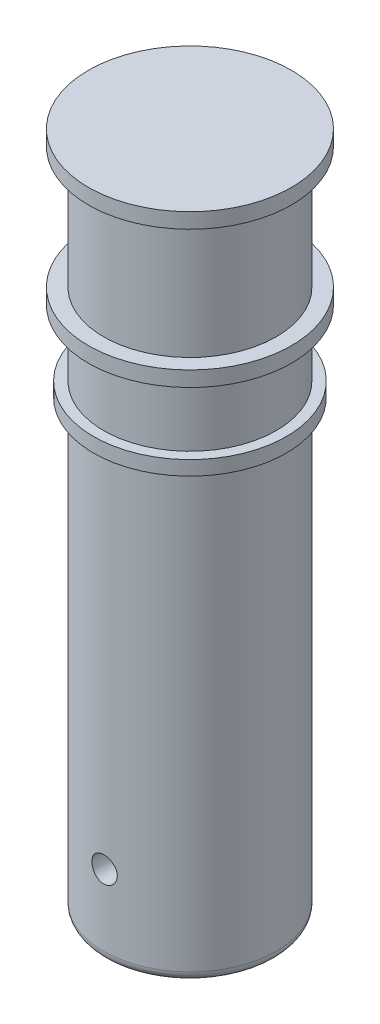
ISO-10303-21;
HEADER;
FILE_DESCRIPTION(('STEP AP214'),'2;1');
FILE_NAME('part.step','',(''),(''),'','','');
FILE_SCHEMA(('AUTOMOTIVE_DESIGN { 1 0 10303 214 1 1 1 1 }'));
ENDSEC;
DATA;
#1=APPLICATION_CONTEXT('core data for automotive mechanical design processes');
#2=APPLICATION_PROTOCOL_DEFINITION('international standard','automotive_design',2000,#1);
#3=PRODUCT_CONTEXT('',#1,'mechanical');
#4=PRODUCT('Part','Part','',(#3));
#5=PRODUCT_RELATED_PRODUCT_CATEGORY('part','',(#4));
#6=PRODUCT_DEFINITION_FORMATION('','',#4);
#7=PRODUCT_DEFINITION_CONTEXT('part definition',#1,'design');
#8=PRODUCT_DEFINITION('design','',#6,#7);
#9=PRODUCT_DEFINITION_SHAPE('','',#8);
#10=(LENGTH_UNIT() NAMED_UNIT(*) SI_UNIT(.MILLI.,.METRE.));
#11=(NAMED_UNIT(*) PLANE_ANGLE_UNIT() SI_UNIT($,.RADIAN.));
#12=(NAMED_UNIT(*) SI_UNIT($,.STERADIAN.) SOLID_ANGLE_UNIT());
#13=UNCERTAINTY_MEASURE_WITH_UNIT(LENGTH_MEASURE(1.E-05),#10,'distance_accuracy_value','');
#14=(GEOMETRIC_REPRESENTATION_CONTEXT(3) GLOBAL_UNCERTAINTY_ASSIGNED_CONTEXT((#13)) GLOBAL_UNIT_ASSIGNED_CONTEXT((#10,
#11,#12)) REPRESENTATION_CONTEXT('',''));
#15=CARTESIAN_POINT('',(0.,0.,0.));
#16=DIRECTION('',(0.,0.,1.));
#17=DIRECTION('',(1.,0.,0.));
#18=AXIS2_PLACEMENT_3D('',#15,#16,#17);
#19=CARTESIAN_POINT('',(0.,-37.915,0.));
#20=DIRECTION('',(0.,-1.,0.));
#21=DIRECTION('',(1.,0.,0.));
#22=AXIS2_PLACEMENT_3D('',#19,#20,#21);
#23=PLANE('',#22);
#24=CARTESIAN_POINT('',(0.,-37.915,0.));
#25=DIRECTION('',(0.,1.,0.));
#26=DIRECTION('',(-1.,0.,0.));
#27=AXIS2_PLACEMENT_3D('',#24,#25,#26);
#28=CIRCLE('',#27,4.);
#29=CARTESIAN_POINT('',(-4.,-37.915,0.));
#30=VERTEX_POINT('',#29);
#31=EDGE_CURVE('E57',#30,#30,#28,.T.);
#32=ORIENTED_EDGE('',*,*,#31,.F.);
#33=EDGE_LOOP('',(#32));
#34=FACE_BOUND('',#33,.T.);
#35=ADVANCED_FACE('F37',(#34),#23,.T.);
#36=CARTESIAN_POINT('',(0.,15.,0.));
#37=DIRECTION('',(0.,1.,0.));
#38=DIRECTION('',(-1.,0.,0.));
#39=AXIS2_PLACEMENT_3D('',#36,#37,#38);
#40=CYLINDRICAL_SURFACE('',#39,4.);
#41=CARTESIAN_POINT('',(-1.25,-43.915,3.79967103839267));
#42=CARTESIAN_POINT('',(-1.24999953780047,-43.8466529638907,3.79967145961936));
#43=CARTESIAN_POINT('',(-1.24437538791494,-43.7783012312968,3.80153531505043));
#44=CARTESIAN_POINT('',(-1.22209175401327,-43.6436058391222,3.80875638998877));
#45=CARTESIAN_POINT('',(-1.20542928782515,-43.5772627272678,3.81411455353136));
#46=CARTESIAN_POINT('',(-1.16169788223559,-43.448555098068,3.8276593883596));
#47=CARTESIAN_POINT('',(-1.13464735736677,-43.3861837668943,3.83584105194317));
#48=CARTESIAN_POINT('',(-1.07096914173157,-43.266847304136,3.85410406218688));
#49=CARTESIAN_POINT('',(-1.03433975905632,-43.2098831300399,3.8641857443584));
#50=CARTESIAN_POINT('',(-0.951196070622293,-43.1010211325065,3.8855012766862));
#51=CARTESIAN_POINT('',(-0.904409399720399,-43.049336390564,3.8967612338478));
#52=CARTESIAN_POINT('',(-0.802862046455494,-42.9544039867908,3.91894245860335));
#53=CARTESIAN_POINT('',(-0.748100252518563,-42.9111575030552,3.92986367872627));
#54=CARTESIAN_POINT('',(-0.630625912493361,-42.8333889369888,3.95043553390078));
#55=CARTESIAN_POINT('',(-0.567761556520095,-42.7990862961685,3.9600518456278));
#56=CARTESIAN_POINT('',(-0.436804232853406,-42.7416239501445,3.97662551833019));
#57=CARTESIAN_POINT('',(-0.368712498487055,-42.7184616258504,3.98358350419919));
#58=CARTESIAN_POINT('',(-0.231464356966101,-42.6846488719029,3.99387175820862));
#59=CARTESIAN_POINT('',(-0.162405715468218,-42.6736342502122,3.99730738984143));
#60=CARTESIAN_POINT('',(-0.0233408139845233,-42.6632756535625,4.00053595876015));
#61=CARTESIAN_POINT('',(0.0466652269730806,-42.6639290256412,4.00032972410065));
#62=CARTESIAN_POINT('',(0.183074480354733,-42.6766482915859,3.99637116132537));
#63=CARTESIAN_POINT('',(0.249518634314043,-42.688319383513,3.99274150972157));
#64=CARTESIAN_POINT('',(0.379453063347769,-42.722094990043,3.98249482560855));
#65=CARTESIAN_POINT('',(0.442943145481195,-42.7442001850866,3.97587759827134));
#66=CARTESIAN_POINT('',(0.56607810315478,-42.7984701890749,3.96023459729533));
#67=CARTESIAN_POINT('',(0.62566640562283,-42.830754808563,3.95118033616957));
#68=CARTESIAN_POINT('',(0.738702511152028,-42.9043710997046,3.93161722953562));
#69=CARTESIAN_POINT('',(0.792148756208837,-42.9457050591378,3.92110801644584));
#70=CARTESIAN_POINT('',(0.89373769845388,-43.0382736348013,3.89923670734647));
#71=CARTESIAN_POINT('',(0.941566549094178,-43.0898490688412,3.88785731989084));
#72=CARTESIAN_POINT('',(1.02798974259538,-43.2003951018245,3.86590615440413));
#73=CARTESIAN_POINT('',(1.06658299775341,-43.259366570575,3.85533447159847));
#74=CARTESIAN_POINT('',(1.13380465019765,-43.3839174688598,3.83610846648974));
#75=CARTESIAN_POINT('',(1.16231680702682,-43.4495634090424,3.82747690354324));
#76=CARTESIAN_POINT('',(1.20778345948513,-43.5850594918954,3.81337545338913));
#77=CARTESIAN_POINT('',(1.22474210765793,-43.6549081142105,3.80790443033294));
#78=CARTESIAN_POINT('',(1.24601485185708,-43.7938199525658,3.80099563391872));
#79=CARTESIAN_POINT('',(1.25080954353711,-43.8628019962321,3.79940466389696));
#80=CARTESIAN_POINT('',(1.24896744498307,-44.0005897414982,3.80001077463985));
#81=CARTESIAN_POINT('',(1.24233242111456,-44.0693954687005,3.8022072700839));
#82=CARTESIAN_POINT('',(1.21824873513143,-44.2028082966516,3.80998957482874));
#83=CARTESIAN_POINT('',(1.20111831160538,-44.267479274074,3.81547554101732));
#84=CARTESIAN_POINT('',(1.15690373661027,-44.393021791996,3.82911287331661));
#85=CARTESIAN_POINT('',(1.12981796171155,-44.4538927109212,3.83726467412388));
#86=CARTESIAN_POINT('',(1.06557510655875,-44.5720391097718,3.85560539653156));
#87=CARTESIAN_POINT('',(1.02815147488557,-44.6291614155928,3.86584603489733));
#88=CARTESIAN_POINT('',(0.94460640867981,-44.7364903463619,3.88710348972829));
#89=CARTESIAN_POINT('',(0.898482714690782,-44.7866951689253,3.89812050735703));
#90=CARTESIAN_POINT('',(0.796572947753604,-44.8809103659128,3.92024187562679));
#91=CARTESIAN_POINT('',(0.740465649788521,-44.9245777861399,3.9313309228568));
#92=CARTESIAN_POINT('',(0.621451545651399,-45.0018910433213,3.95189059843678));
#93=CARTESIAN_POINT('',(0.558545051108625,-45.035537339311,3.96136130090946));
#94=CARTESIAN_POINT('',(0.428105523331832,-45.0915305624717,3.97756311928512));
#95=CARTESIAN_POINT('',(0.360610184283756,-45.1139592878437,3.984313995612));
#96=CARTESIAN_POINT('',(0.222557254056389,-45.1470725385897,3.99440242648576));
#97=CARTESIAN_POINT('',(0.152000628340356,-45.1577607390835,3.99774104914277));
#98=CARTESIAN_POINT('',(0.0129849366488987,-45.1667910017496,4.00055803404462));
#99=CARTESIAN_POINT('',(-0.0554391919465219,-45.1656284501708,4.0001912940739));
#100=CARTESIAN_POINT('',(-0.191073221923247,-45.1521881889513,3.99600978081049));
#101=CARTESIAN_POINT('',(-0.258283202179567,-45.1399112040081,3.99219523232619));
#102=CARTESIAN_POINT('',(-0.388755118480791,-45.1049059907777,3.98159570844796));
#103=CARTESIAN_POINT('',(-0.452055918449482,-45.0823103921546,3.97484847960205));
#104=CARTESIAN_POINT('',(-0.573998425500092,-45.0274291727915,3.9590794558795));
#105=CARTESIAN_POINT('',(-0.632639331274482,-44.9951418900266,3.95005727091358));
#106=CARTESIAN_POINT('',(-0.745761694969687,-44.9205272416556,3.93029896883376));
#107=CARTESIAN_POINT('',(-0.80003460705311,-44.877896477536,3.91951509750962));
#108=CARTESIAN_POINT('',(-0.900820791399316,-44.7843401105565,3.89758736547061));
#109=CARTESIAN_POINT('',(-0.947331733504156,-44.7334120258606,3.88644339784826));
#110=CARTESIAN_POINT('',(-1.03282865911252,-44.6226842801589,3.86461892577438));
#111=CARTESIAN_POINT('',(-1.07151427994711,-44.5626465968834,3.85396600863456));
#112=CARTESIAN_POINT('',(-1.13820470748521,-44.4366018797309,3.83480125279531));
#113=CARTESIAN_POINT('',(-1.16621383403546,-44.3705972735497,3.82628854861386));
#114=CARTESIAN_POINT('',(-1.20871180435792,-44.2402773826853,3.81306560440327));
#115=CARTESIAN_POINT('',(-1.22414939837873,-44.1762974525484,3.80809315043749));
#116=CARTESIAN_POINT('',(-1.244792458161,-44.0465461679035,3.80139606482398));
#117=CARTESIAN_POINT('',(-1.25000044480778,-43.9807752587985,3.79967063301598));
#118=CARTESIAN_POINT('',(-1.25,-43.915,3.79967103839267));
#119=B_SPLINE_CURVE_WITH_KNOTS('',3,(#41,#42,#43,#44,#45,#46,#47,#48,#49,#50,#51,#52,#53,#54,
#55,#56,#57,#58,#59,#60,#61,#62,#63,#64,#65,#66,#67,#68,#69,#70,#71,#72,#73,#74,#75,#76,#77,#78,
#79,#80,#81,#82,#83,#84,#85,#86,#87,#88,#89,#90,#91,#92,#93,#94,#95,#96,#97,#98,#99,#100,#101,
#102,#103,#104,#105,#106,#107,#108,#109,#110,#111,#112,#113,#114,#115,#116,#117,#118),
.UNSPECIFIED.,.T.,.F.,(4,2,2,2,2,2,2,2,2,2,2,2,2,2,2,2,2,2,2,2,2,2,2,2,2,2,2,2,2,2,2,2,2,2,2,2,
2,2,4),(0.,0.204798137548501,0.409651627059736,0.614143644118579,0.818671804924945,
1.02957080550838,1.24049922941123,1.45619821963733,1.67184647417921,1.88083722835533,
2.08978046471774,2.2915098296975,2.49325235190093,2.69746404608409,2.90172742713187,
3.11450338937334,3.32730439853776,3.54248470934454,3.75758763952753,3.96404933287934,
4.17047912219088,4.37093972044362,4.5714330225321,4.7776761330961,4.9839728801188,
5.1988193781151,5.41365603317086,5.62690239290998,5.84008198140585,6.04438802439524,
6.24868074692306,6.45041846514759,6.65219079911652,6.86080693105214,7.06948557772189,
7.28507795501704,7.50058300803822,7.69772354371385,7.89481549188778),.UNSPECIFIED.);
#120=CARTESIAN_POINT('',(-1.25,-43.915,3.79967103839267));
#121=VERTEX_POINT('',#120);
#122=EDGE_CURVE('E93',#121,#121,#119,.T.);
#123=ORIENTED_EDGE('',*,*,#122,.F.);
#124=EDGE_LOOP('',(#123));
#125=FACE_BOUND('',#124,.T.);
#126=CARTESIAN_POINT('',(0.,-50.915,0.));
#127=DIRECTION('',(0.,-1.,0.));
#128=DIRECTION('',(1.,0.,0.));
#129=AXIS2_PLACEMENT_3D('',#126,#127,#128);
#130=CIRCLE('',#129,4.);
#131=CARTESIAN_POINT('',(4.00000000000001,-50.915,0.));
#132=VERTEX_POINT('',#131);
#133=EDGE_CURVE('E10',#132,#132,#130,.T.);
#134=ORIENTED_EDGE('',*,*,#133,.T.);
#135=EDGE_LOOP('',(#134));
#136=FACE_BOUND('',#135,.T.);
#137=ORIENTED_EDGE('',*,*,#31,.T.);
#138=EDGE_LOOP('',(#137));
#139=FACE_BOUND('',#138,.T.);
#140=ADVANCED_FACE('F106',(#125,#136,#139),#40,.F.);
#141=CARTESIAN_POINT('',(-4.,-51.915,0.));
#142=DIRECTION('',(0.,-1.,0.));
#143=DIRECTION('',(1.,0.,0.));
#144=AXIS2_PLACEMENT_3D('',#141,#142,#143);
#145=PLANE('',#144);
#146=CARTESIAN_POINT('',(0.,-51.915,0.));
#147=DIRECTION('',(0.,-1.,0.));
#148=DIRECTION('',(1.,0.,0.));
#149=AXIS2_PLACEMENT_3D('',#146,#147,#148);
#150=CIRCLE('',#149,7.5);
#151=CARTESIAN_POINT('',(7.5,-51.915,0.));
#152=VERTEX_POINT('',#151);
#153=EDGE_CURVE('E44',#152,#152,#150,.T.);
#154=ORIENTED_EDGE('',*,*,#153,.T.);
#155=EDGE_LOOP('',(#154));
#156=FACE_BOUND('',#155,.T.);
#157=CARTESIAN_POINT('',(0.,-51.915,0.));
#158=DIRECTION('',(0.,-1.,0.));
#159=DIRECTION('',(1.,0.,0.));
#160=AXIS2_PLACEMENT_3D('',#157,#158,#159);
#161=CIRCLE('',#160,5.);
#162=CARTESIAN_POINT('',(5.00000000000001,-51.915,0.));
#163=VERTEX_POINT('',#162);
#164=EDGE_CURVE('E48',#163,#163,#161,.F.);
#165=ORIENTED_EDGE('',*,*,#164,.T.);
#166=EDGE_LOOP('',(#165));
#167=FACE_BOUND('',#166,.T.);
#168=ADVANCED_FACE('F164',(#156,#167),#145,.T.);
#169=CARTESIAN_POINT('',(0.,15.,0.));
#170=DIRECTION('',(0.,1.,0.));
#171=DIRECTION('',(-1.,0.,0.));
#172=AXIS2_PLACEMENT_3D('',#169,#170,#171);
#173=CYLINDRICAL_SURFACE('',#172,8.49999999999999);
#174=CARTESIAN_POINT('',(-1.25,-43.915,8.40758586040011));
#175=CARTESIAN_POINT('',(-1.24999710510227,-43.9848045307349,8.40758700940734));
#176=CARTESIAN_POINT('',(-1.24413302561147,-44.0546499774146,8.408464600162));
#177=CARTESIAN_POINT('',(-1.22083722377046,-44.1923892099967,8.41187789658697));
#178=CARTESIAN_POINT('',(-1.20339411636137,-44.2602810063584,8.41441523416455));
#179=CARTESIAN_POINT('',(-1.15747242113108,-44.3920991959618,8.42085456460099));
#180=CARTESIAN_POINT('',(-1.12900217790827,-44.4560285453842,8.42475552534398));
#181=CARTESIAN_POINT('',(-1.06185381528303,-44.5781932019976,8.43348133440081));
#182=CARTESIAN_POINT('',(-1.02317714404783,-44.6364293153837,8.43830605161827));
#183=CARTESIAN_POINT('',(-0.936395680627589,-44.7460121715149,8.44837729235549));
#184=CARTESIAN_POINT('',(-0.888227811627049,-44.797308722437,8.45362649120866));
#185=CARTESIAN_POINT('',(-0.783967427241611,-44.8911215515143,8.46393134335555));
#186=CARTESIAN_POINT('',(-0.727874481842023,-44.9336373529176,8.46898698612797));
#187=CARTESIAN_POINT('',(-0.609035362725142,-45.008866414533,8.4783630159218));
#188=CARTESIAN_POINT('',(-0.546259688480517,-45.0415335461939,8.48267990326487));
#189=CARTESIAN_POINT('',(-0.416038601354244,-45.0958420195621,8.49006242091287));
#190=CARTESIAN_POINT('',(-0.348593426034829,-45.1174839217137,8.49312811481799));
#191=CARTESIAN_POINT('',(-0.211464398495231,-45.1489757010046,8.49764395451441));
#192=CARTESIAN_POINT('',(-0.141800218809728,-45.1589095651021,8.49910560156349));
#193=CARTESIAN_POINT('',(-0.00177945680603085,-45.1669640047736,8.50028806047439));
#194=CARTESIAN_POINT('',(0.0685770882440742,-45.1650852127547,8.50000896552926));
#195=CARTESIAN_POINT('',(0.20741260926797,-45.1496340815761,8.49775059098031));
#196=CARTESIAN_POINT('',(0.275901884682537,-45.1361520951745,8.49578444857936));
#197=CARTESIAN_POINT('',(0.409635277137452,-45.0980190301375,8.49038753926088));
#198=CARTESIAN_POINT('',(0.474879313262815,-45.073367673166,8.48695673584473));
#199=CARTESIAN_POINT('',(0.600544454522743,-45.0135026788097,8.47899339387314));
#200=CARTESIAN_POINT('',(0.66094711365584,-44.9782508702462,8.47445688515938));
#201=CARTESIAN_POINT('',(0.775013746624383,-44.8982134973463,8.46478797434031));
#202=CARTESIAN_POINT('',(0.828677293524276,-44.8534273294741,8.45965553452124));
#203=CARTESIAN_POINT('',(0.928274771197664,-44.7550888692555,8.44931012765942));
#204=CARTESIAN_POINT('',(0.97413083344061,-44.7014577081385,8.44409685803329));
#205=CARTESIAN_POINT('',(1.05620396332034,-44.5872199852064,8.43422475926411));
#206=CARTESIAN_POINT('',(1.09242097588368,-44.5266133835396,8.429565933289));
#207=CARTESIAN_POINT('',(1.15419768439827,-44.4000655107819,8.42133032189469));
#208=CARTESIAN_POINT('',(1.17974960098851,-44.3341203873689,8.41775432683684));
#209=CARTESIAN_POINT('',(1.21939363445995,-44.1988104313511,8.41210341899183));
#210=CARTESIAN_POINT('',(1.23348652609985,-44.1294458302779,8.41002840472255));
#211=CARTESIAN_POINT('',(1.24970613657199,-43.989958088404,8.40763356673708));
#212=CARTESIAN_POINT('',(1.25194313773078,-43.9198480391685,8.40729756756401));
#213=CARTESIAN_POINT('',(1.2446798881272,-43.7802540518017,8.40837587949711));
#214=CARTESIAN_POINT('',(1.23517998693919,-43.7107700950848,8.40979013847321));
#215=CARTESIAN_POINT('',(1.20480604960235,-43.5747409257275,8.41419476930312));
#216=CARTESIAN_POINT('',(1.18398676081403,-43.5081832213757,8.41717755257087));
#217=CARTESIAN_POINT('',(1.13162190536935,-43.3795023379237,8.42437690391731));
#218=CARTESIAN_POINT('',(1.10007582796816,-43.3173793701493,8.42859353074283));
#219=CARTESIAN_POINT('',(1.02688712390612,-43.198836456236,8.43782365247836));
#220=CARTESIAN_POINT('',(0.985172989894867,-43.1424610987135,8.44284270041291));
#221=CARTESIAN_POINT('',(0.892931901207418,-43.0374716244546,8.45309533274159));
#222=CARTESIAN_POINT('',(0.842404468153765,-42.9888579292883,8.45832892876938));
#223=CARTESIAN_POINT('',(0.733485882129778,-42.9003767814535,8.46847140977382));
#224=CARTESIAN_POINT('',(0.675035107129501,-42.860582337148,8.47337736523611));
#225=CARTESIAN_POINT('',(0.552214316327245,-42.7913775225772,8.48226649910813));
#226=CARTESIAN_POINT('',(0.487844457355889,-42.7619668772851,8.48624970195704));
#227=CARTESIAN_POINT('',(0.355242512242695,-42.7144816728052,8.4928316761749));
#228=CARTESIAN_POINT('',(0.287025077389444,-42.6963669085891,8.49543535260939));
#229=CARTESIAN_POINT('',(0.148475541166711,-42.671857469766,8.49898547341227));
#230=CARTESIAN_POINT('',(0.0781435740928537,-42.6654620524455,8.49993202280092));
#231=CARTESIAN_POINT('',(-0.0619298668379428,-42.6645904384732,8.50006025774637));
#232=CARTESIAN_POINT('',(-0.131670655626724,-42.6700024258134,8.49925849979376));
#233=CARTESIAN_POINT('',(-0.269239179820509,-42.6923526840448,8.49601352815675));
#234=CARTESIAN_POINT('',(-0.337066920661137,-42.7092909221824,8.49357031913676));
#235=CARTESIAN_POINT('',(-0.468855272056405,-42.7541737577989,8.48731568295444));
#236=CARTESIAN_POINT('',(-0.532818464760778,-42.7821109102611,8.48350518144819));
#237=CARTESIAN_POINT('',(-0.655166929115879,-42.8481866771456,8.47493492093455));
#238=CARTESIAN_POINT('',(-0.713552033805032,-42.8863255967943,8.4701751335266));
#239=CARTESIAN_POINT('',(-0.823654696466402,-42.972127837482,8.46018209258476));
#240=CARTESIAN_POINT('',(-0.875307495715045,-43.0198738136239,8.45494496231288));
#241=CARTESIAN_POINT('',(-0.969908817337546,-43.123361010639,8.44461647463574));
#242=CARTESIAN_POINT('',(-1.01285529235082,-43.1791041068472,8.43952515175939));
#243=CARTESIAN_POINT('',(-1.08903160606816,-43.2973554895497,8.43003535108945));
#244=CARTESIAN_POINT('',(-1.12220785319988,-43.3598986035356,8.4256407535303));
#245=CARTESIAN_POINT('',(-1.17753570240274,-43.4897037247094,8.41808744433527));
#246=CARTESIAN_POINT('',(-1.19969881567852,-43.5569607205443,8.41492744301018));
#247=CARTESIAN_POINT('',(-1.22730605825343,-43.6729382510754,8.41093594969734));
#248=CARTESIAN_POINT('',(-1.23580336635801,-43.7209403764295,8.40968627498973));
#249=CARTESIAN_POINT('',(-1.24715131261068,-43.8176217018972,8.40801083456298));
#250=CARTESIAN_POINT('',(-1.25000201962438,-43.8663008937459,8.40758505879563));
#251=CARTESIAN_POINT('',(-1.25,-43.915,8.40758586040011));
#252=B_SPLINE_CURVE_WITH_KNOTS('',3,(#174,#175,#176,#177,#178,#179,#180,#181,#182,#183,#184,
#185,#186,#187,#188,#189,#190,#191,#192,#193,#194,#195,#196,#197,#198,#199,#200,#201,#202,#203,
#204,#205,#206,#207,#208,#209,#210,#211,#212,#213,#214,#215,#216,#217,#218,#219,#220,#221,#222,
#223,#224,#225,#226,#227,#228,#229,#230,#231,#232,#233,#234,#235,#236,#237,#238,#239,#240,#241,
#242,#243,#244,#245,#246,#247,#248,#249,#250,#251),.UNSPECIFIED.,.T.,.F.,(4,2,2,2,2,2,2,2,2,2,2,
2,2,2,2,2,2,2,2,2,2,2,2,2,2,2,2,2,2,2,2,2,2,2,2,2,2,2,4),(0.,0.209235604041352,
0.418677243956451,0.627960701137757,0.837214479508831,1.0479089137279,1.25861478462188,
1.47029273888423,1.68195993187107,1.8920993174321,2.10222745298405,2.3107339980099,
2.51924573921819,2.72851748935693,2.9378024905773,3.14906598586865,3.36033068820406,
3.57174922359478,3.78315346353081,3.99258774581621,4.20201579041742,4.41043981091345,
4.61887375669134,4.82881810275995,5.03877384795542,5.25040763301589,5.46203581229343,
5.67290638591942,5.88376359516139,6.09263266274005,6.30150113679018,6.51022847299387,
6.71896205480251,6.92957482323234,7.14023706160588,7.35203417379323,7.56360944219752,
7.70958436789297,7.85555751327589),.UNSPECIFIED.);
#253=CARTESIAN_POINT('',(-1.25,-43.915,8.40758586040011));
#254=VERTEX_POINT('',#253);
#255=EDGE_CURVE('E101',#254,#254,#252,.T.);
#256=ORIENTED_EDGE('',*,*,#255,.F.);
#257=EDGE_LOOP('',(#256));
#258=FACE_BOUND('',#257,.T.);
#259=CARTESIAN_POINT('',(0.,-50.915,0.));
#260=DIRECTION('',(0.,-1.,0.));
#261=DIRECTION('',(1.,0.,0.));
#262=AXIS2_PLACEMENT_3D('',#259,#260,#261);
#263=CIRCLE('',#262,8.49999999999999);
#264=CARTESIAN_POINT('',(8.5,-50.915,0.));
#265=VERTEX_POINT('',#264);
#266=EDGE_CURVE('E52',#265,#265,#263,.F.);
#267=ORIENTED_EDGE('',*,*,#266,.T.);
#268=EDGE_LOOP('',(#267));
#269=FACE_BOUND('',#268,.T.);
#270=CARTESIAN_POINT('',(0.,-7.91500000000001,0.));
#271=DIRECTION('',(0.,1.,0.));
#272=DIRECTION('',(-1.,0.,0.));
#273=AXIS2_PLACEMENT_3D('',#270,#271,#272);
#274=CIRCLE('',#273,8.49999999999999);
#275=CARTESIAN_POINT('',(-8.49999999999999,-7.91500000000001,0.));
#276=VERTEX_POINT('',#275);
#277=EDGE_CURVE('E60',#276,#276,#274,.T.);
#278=ORIENTED_EDGE('',*,*,#277,.F.);
#279=EDGE_LOOP('',(#278));
#280=FACE_BOUND('',#279,.T.);
#281=ADVANCED_FACE('F161',(#258,#269,#280),#173,.T.);
#282=CARTESIAN_POINT('',(-8.49999999999999,-7.91500000000001,0.));
#283=DIRECTION('',(0.,-1.,0.));
#284=DIRECTION('',(1.,0.,0.));
#285=AXIS2_PLACEMENT_3D('',#282,#283,#284);
#286=PLANE('',#285);
#287=ORIENTED_EDGE('',*,*,#277,.T.);
#288=EDGE_LOOP('',(#287));
#289=FACE_BOUND('',#288,.T.);
#290=CARTESIAN_POINT('',(0.,-7.91500000000001,0.));
#291=DIRECTION('',(0.,1.,0.));
#292=DIRECTION('',(-1.,0.,0.));
#293=AXIS2_PLACEMENT_3D('',#290,#291,#292);
#294=CIRCLE('',#293,9.49999999999999);
#295=CARTESIAN_POINT('',(-9.49999999999999,-7.91500000000001,0.));
#296=VERTEX_POINT('',#295);
#297=EDGE_CURVE('E63',#296,#296,#294,.T.);
#298=ORIENTED_EDGE('',*,*,#297,.F.);
#299=EDGE_LOOP('',(#298));
#300=FACE_BOUND('',#299,.T.);
#301=ADVANCED_FACE('F157',(#289,#300),#286,.T.);
#302=CARTESIAN_POINT('',(0.,15.,0.));
#303=DIRECTION('',(0.,1.,0.));
#304=DIRECTION('',(-1.,0.,0.));
#305=AXIS2_PLACEMENT_3D('',#302,#303,#304);
#306=CYLINDRICAL_SURFACE('',#305,9.49999999999999);
#307=ORIENTED_EDGE('',*,*,#297,.T.);
#308=EDGE_LOOP('',(#307));
#309=FACE_BOUND('',#308,.T.);
#310=CARTESIAN_POINT('',(0.,-6.5,0.));
#311=DIRECTION('',(0.,1.,0.));
#312=DIRECTION('',(-1.,0.,0.));
#313=AXIS2_PLACEMENT_3D('',#310,#311,#312);
#314=CIRCLE('',#313,9.49999999999999);
#315=CARTESIAN_POINT('',(-9.49999999999999,-6.5,0.));
#316=VERTEX_POINT('',#315);
#317=EDGE_CURVE('E66',#316,#316,#314,.T.);
#318=ORIENTED_EDGE('',*,*,#317,.F.);
#319=EDGE_LOOP('',(#318));
#320=FACE_BOUND('',#319,.T.);
#321=ADVANCED_FACE('F153',(#309,#320),#306,.T.);
#322=CARTESIAN_POINT('',(-9.49999999999999,-6.5,0.));
#323=DIRECTION('',(0.,1.,0.));
#324=DIRECTION('',(-1.,0.,0.));
#325=AXIS2_PLACEMENT_3D('',#322,#323,#324);
#326=PLANE('',#325);
#327=ORIENTED_EDGE('',*,*,#317,.T.);
#328=EDGE_LOOP('',(#327));
#329=FACE_BOUND('',#328,.T.);
#330=CARTESIAN_POINT('',(0.,-6.5,0.));
#331=DIRECTION('',(0.,1.,0.));
#332=DIRECTION('',(-1.,0.,0.));
#333=AXIS2_PLACEMENT_3D('',#330,#331,#332);
#334=CIRCLE('',#333,8.49999999999999);
#335=CARTESIAN_POINT('',(-8.49999999999999,-6.5,0.));
#336=VERTEX_POINT('',#335);
#337=EDGE_CURVE('E69',#336,#336,#334,.T.);
#338=ORIENTED_EDGE('',*,*,#337,.F.);
#339=EDGE_LOOP('',(#338));
#340=FACE_BOUND('',#339,.T.);
#341=ADVANCED_FACE('F149',(#329,#340),#326,.T.);
#342=CARTESIAN_POINT('',(0.,15.,0.));
#343=DIRECTION('',(0.,1.,0.));
#344=DIRECTION('',(-1.,0.,0.));
#345=AXIS2_PLACEMENT_3D('',#342,#343,#344);
#346=CYLINDRICAL_SURFACE('',#345,8.49999999999999);
#347=ORIENTED_EDGE('',*,*,#337,.T.);
#348=EDGE_LOOP('',(#347));
#349=FACE_BOUND('',#348,.T.);
#350=CARTESIAN_POINT('',(0.,0.,0.));
#351=DIRECTION('',(0.,1.,0.));
#352=DIRECTION('',(-1.,0.,0.));
#353=AXIS2_PLACEMENT_3D('',#350,#351,#352);
#354=CIRCLE('',#353,8.49999999999999);
#355=CARTESIAN_POINT('',(-8.49999999999999,0.,0.));
#356=VERTEX_POINT('',#355);
#357=EDGE_CURVE('E72',#356,#356,#354,.T.);
#358=ORIENTED_EDGE('',*,*,#357,.F.);
#359=EDGE_LOOP('',(#358));
#360=FACE_BOUND('',#359,.T.);
#361=ADVANCED_FACE('F145',(#349,#360),#346,.T.);
#362=CARTESIAN_POINT('',(-8.49999999999999,0.,0.));
#363=DIRECTION('',(0.,-1.,0.));
#364=DIRECTION('',(1.,0.,0.));
#365=AXIS2_PLACEMENT_3D('',#362,#363,#364);
#366=PLANE('',#365);
#367=ORIENTED_EDGE('',*,*,#357,.T.);
#368=EDGE_LOOP('',(#367));
#369=FACE_BOUND('',#368,.T.);
#370=CARTESIAN_POINT('',(0.,0.,0.));
#371=DIRECTION('',(0.,1.,0.));
#372=DIRECTION('',(-1.,0.,0.));
#373=AXIS2_PLACEMENT_3D('',#370,#371,#372);
#374=CIRCLE('',#373,10.);
#375=CARTESIAN_POINT('',(-10.,0.,0.));
#376=VERTEX_POINT('',#375);
#377=EDGE_CURVE('E75',#376,#376,#374,.T.);
#378=ORIENTED_EDGE('',*,*,#377,.F.);
#379=EDGE_LOOP('',(#378));
#380=FACE_BOUND('',#379,.T.);
#381=ADVANCED_FACE('F141',(#369,#380),#366,.T.);
#382=CARTESIAN_POINT('',(0.,15.,0.));
#383=DIRECTION('',(0.,1.,0.));
#384=DIRECTION('',(-1.,0.,0.));
#385=AXIS2_PLACEMENT_3D('',#382,#383,#384);
#386=CYLINDRICAL_SURFACE('',#385,10.);
#387=ORIENTED_EDGE('',*,*,#377,.T.);
#388=EDGE_LOOP('',(#387));
#389=FACE_BOUND('',#388,.T.);
#390=CARTESIAN_POINT('',(0.,1.5,0.));
#391=DIRECTION('',(0.,1.,0.));
#392=DIRECTION('',(-1.,0.,0.));
#393=AXIS2_PLACEMENT_3D('',#390,#391,#392);
#394=CIRCLE('',#393,10.);
#395=CARTESIAN_POINT('',(-10.,1.5,0.));
#396=VERTEX_POINT('',#395);
#397=EDGE_CURVE('E78',#396,#396,#394,.T.);
#398=ORIENTED_EDGE('',*,*,#397,.F.);
#399=EDGE_LOOP('',(#398));
#400=FACE_BOUND('',#399,.T.);
#401=ADVANCED_FACE('F137',(#389,#400),#386,.T.);
#402=CARTESIAN_POINT('',(-10.,1.5,0.));
#403=DIRECTION('',(0.,1.,0.));
#404=DIRECTION('',(-1.,0.,0.));
#405=AXIS2_PLACEMENT_3D('',#402,#403,#404);
#406=PLANE('',#405);
#407=ORIENTED_EDGE('',*,*,#397,.T.);
#408=EDGE_LOOP('',(#407));
#409=FACE_BOUND('',#408,.T.);
#410=CARTESIAN_POINT('',(0.,1.5,0.));
#411=DIRECTION('',(0.,1.,0.));
#412=DIRECTION('',(-1.,0.,0.));
#413=AXIS2_PLACEMENT_3D('',#410,#411,#412);
#414=CIRCLE('',#413,8.5);
#415=CARTESIAN_POINT('',(-8.5,1.5,0.));
#416=VERTEX_POINT('',#415);
#417=EDGE_CURVE('E81',#416,#416,#414,.T.);
#418=ORIENTED_EDGE('',*,*,#417,.F.);
#419=EDGE_LOOP('',(#418));
#420=FACE_BOUND('',#419,.T.);
#421=ADVANCED_FACE('F133',(#409,#420),#406,.T.);
#422=CARTESIAN_POINT('',(0.,15.,0.));
#423=DIRECTION('',(0.,1.,0.));
#424=DIRECTION('',(-1.,0.,0.));
#425=AXIS2_PLACEMENT_3D('',#422,#423,#424);
#426=CYLINDRICAL_SURFACE('',#425,8.5);
#427=ORIENTED_EDGE('',*,*,#417,.T.);
#428=EDGE_LOOP('',(#427));
#429=FACE_BOUND('',#428,.T.);
#430=CARTESIAN_POINT('',(0.,13.5,0.));
#431=DIRECTION('',(0.,1.,0.));
#432=DIRECTION('',(-1.,0.,0.));
#433=AXIS2_PLACEMENT_3D('',#430,#431,#432);
#434=CIRCLE('',#433,8.5);
#435=CARTESIAN_POINT('',(-8.5,13.5,0.));
#436=VERTEX_POINT('',#435);
#437=EDGE_CURVE('E84',#436,#436,#434,.T.);
#438=ORIENTED_EDGE('',*,*,#437,.F.);
#439=EDGE_LOOP('',(#438));
#440=FACE_BOUND('',#439,.T.);
#441=ADVANCED_FACE('F129',(#429,#440),#426,.T.);
#442=CARTESIAN_POINT('',(-8.5,13.5,0.));
#443=DIRECTION('',(0.,-1.,0.));
#444=DIRECTION('',(1.,0.,0.));
#445=AXIS2_PLACEMENT_3D('',#442,#443,#444);
#446=PLANE('',#445);
#447=ORIENTED_EDGE('',*,*,#437,.T.);
#448=EDGE_LOOP('',(#447));
#449=FACE_BOUND('',#448,.T.);
#450=CARTESIAN_POINT('',(0.,13.5,0.));
#451=DIRECTION('',(0.,1.,0.));
#452=DIRECTION('',(-1.,0.,0.));
#453=AXIS2_PLACEMENT_3D('',#450,#451,#452);
#454=CIRCLE('',#453,10.);
#455=CARTESIAN_POINT('',(-10.,13.5,0.));
#456=VERTEX_POINT('',#455);
#457=EDGE_CURVE('E87',#456,#456,#454,.T.);
#458=ORIENTED_EDGE('',*,*,#457,.F.);
#459=EDGE_LOOP('',(#458));
#460=FACE_BOUND('',#459,.T.);
#461=ADVANCED_FACE('F125',(#449,#460),#446,.T.);
#462=CARTESIAN_POINT('',(0.,15.,0.));
#463=DIRECTION('',(0.,1.,0.));
#464=DIRECTION('',(-1.,0.,0.));
#465=AXIS2_PLACEMENT_3D('',#462,#463,#464);
#466=CYLINDRICAL_SURFACE('',#465,10.);
#467=ORIENTED_EDGE('',*,*,#457,.T.);
#468=EDGE_LOOP('',(#467));
#469=FACE_BOUND('',#468,.T.);
#470=CARTESIAN_POINT('',(0.,15.,0.));
#471=DIRECTION('',(0.,1.,0.));
#472=DIRECTION('',(-1.,0.,0.));
#473=AXIS2_PLACEMENT_3D('',#470,#471,#472);
#474=CIRCLE('',#473,10.);
#475=CARTESIAN_POINT('',(-10.,15.,0.));
#476=VERTEX_POINT('',#475);
#477=EDGE_CURVE('E90',#476,#476,#474,.T.);
#478=ORIENTED_EDGE('',*,*,#477,.F.);
#479=EDGE_LOOP('',(#478));
#480=FACE_BOUND('',#479,.T.);
#481=ADVANCED_FACE('F121',(#469,#480),#466,.T.);
#482=CARTESIAN_POINT('',(-10.,15.,0.));
#483=DIRECTION('',(0.,1.,0.));
#484=DIRECTION('',(-1.,0.,0.));
#485=AXIS2_PLACEMENT_3D('',#482,#483,#484);
#486=PLANE('',#485);
#487=ORIENTED_EDGE('',*,*,#477,.T.);
#488=EDGE_LOOP('',(#487));
#489=FACE_BOUND('',#488,.T.);
#490=ADVANCED_FACE('F117',(#489),#486,.T.);
#491=CARTESIAN_POINT('',(0.,-50.915,0.));
#492=DIRECTION('',(0.,-1.,0.));
#493=DIRECTION('',(1.,0.,0.));
#494=AXIS2_PLACEMENT_3D('',#491,#492,#493);
#495=TOROIDAL_SURFACE('',#494,7.5,1.);
#496=ORIENTED_EDGE('',*,*,#153,.F.);
#497=EDGE_LOOP('',(#496));
#498=FACE_BOUND('',#497,.T.);
#499=ORIENTED_EDGE('',*,*,#266,.F.);
#500=EDGE_LOOP('',(#499));
#501=FACE_BOUND('',#500,.T.);
#502=ADVANCED_FACE('F120',(#498,#501),#495,.T.);
#503=CARTESIAN_POINT('',(0.,-50.915,0.));
#504=DIRECTION('',(0.,-1.,0.));
#505=DIRECTION('',(1.,0.,0.));
#506=AXIS2_PLACEMENT_3D('',#503,#504,#505);
#507=TOROIDAL_SURFACE('',#506,5.,1.);
#508=ORIENTED_EDGE('',*,*,#133,.F.);
#509=EDGE_LOOP('',(#508));
#510=FACE_BOUND('',#509,.T.);
#511=ORIENTED_EDGE('',*,*,#164,.F.);
#512=EDGE_LOOP('',(#511));
#513=FACE_BOUND('',#512,.T.);
#514=ADVANCED_FACE('F39',(#510,#513),#507,.T.);
#515=CARTESIAN_POINT('',(0.,-43.915,0.));
#516=DIRECTION('',(0.,0.,-1.));
#517=DIRECTION('',(-1.,0.,0.));
#518=AXIS2_PLACEMENT_3D('',#515,#516,#517);
#519=CYLINDRICAL_SURFACE('',#518,1.25);
#520=ORIENTED_EDGE('',*,*,#122,.T.);
#521=EDGE_LOOP('',(#520));
#522=FACE_BOUND('',#521,.T.);
#523=ORIENTED_EDGE('',*,*,#255,.T.);
#524=EDGE_LOOP('',(#523));
#525=FACE_BOUND('',#524,.T.);
#526=ADVANCED_FACE('F110',(#522,#525),#519,.F.);
#527=CLOSED_SHELL('',(#35,#140,#168,#281,#301,#321,#341,#361,#381,#401,#421,#441,#461,#481,#490,
#502,#514,#526));
#528=MANIFOLD_SOLID_BREP('B2',#527);
#529=ADVANCED_BREP_SHAPE_REPRESENTATION('',(#18,#528),#14);
#530=SHAPE_DEFINITION_REPRESENTATION(#9,#529);
ENDSEC;
END-ISO-10303-21;
